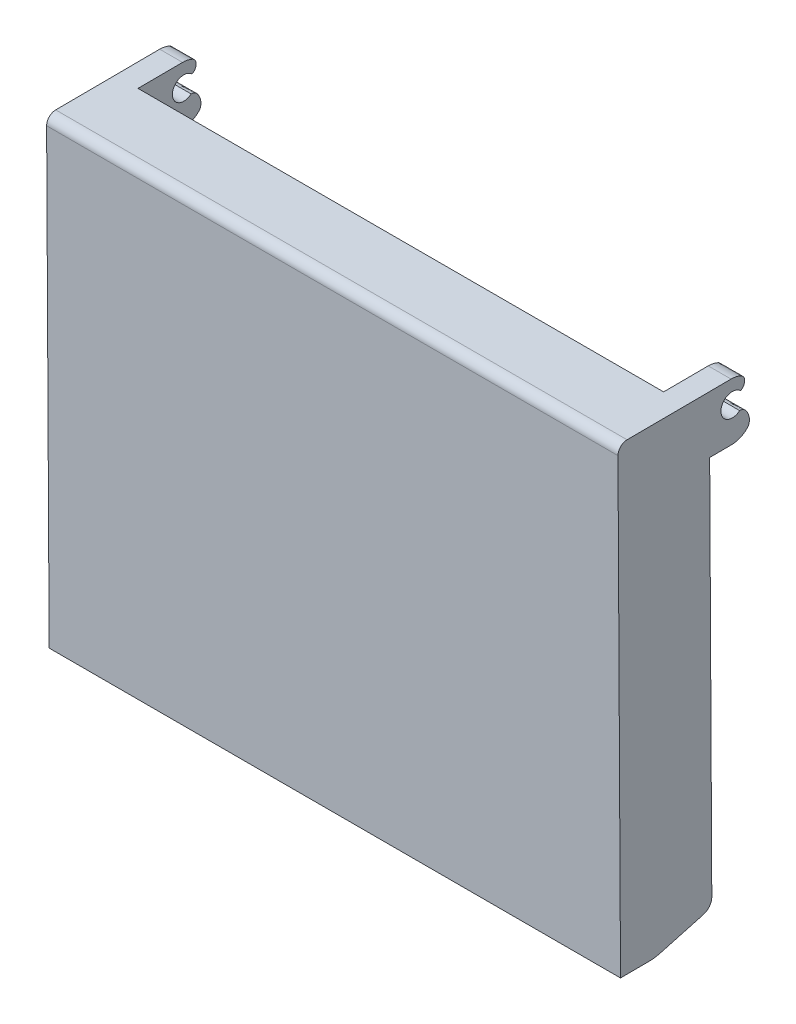
ISO-10303-21;
HEADER;
FILE_DESCRIPTION(('STEP AP214'),'2;1');
FILE_NAME('part.step','',(''),(''),'','','');
FILE_SCHEMA(('AUTOMOTIVE_DESIGN { 1 0 10303 214 1 1 1 1 }'));
ENDSEC;
DATA;
#1=APPLICATION_CONTEXT('core data for automotive mechanical design processes');
#2=APPLICATION_PROTOCOL_DEFINITION('international standard','automotive_design',2000,#1);
#3=PRODUCT_CONTEXT('',#1,'mechanical');
#4=PRODUCT('Part','Part','',(#3));
#5=PRODUCT_RELATED_PRODUCT_CATEGORY('part','',(#4));
#6=PRODUCT_DEFINITION_FORMATION('','',#4);
#7=PRODUCT_DEFINITION_CONTEXT('part definition',#1,'design');
#8=PRODUCT_DEFINITION('design','',#6,#7);
#9=PRODUCT_DEFINITION_SHAPE('','',#8);
#10=(LENGTH_UNIT() NAMED_UNIT(*) SI_UNIT(.MILLI.,.METRE.));
#11=(NAMED_UNIT(*) PLANE_ANGLE_UNIT() SI_UNIT($,.RADIAN.));
#12=(NAMED_UNIT(*) SI_UNIT($,.STERADIAN.) SOLID_ANGLE_UNIT());
#13=UNCERTAINTY_MEASURE_WITH_UNIT(LENGTH_MEASURE(1.E-05),#10,'distance_accuracy_value','');
#14=(GEOMETRIC_REPRESENTATION_CONTEXT(3) GLOBAL_UNCERTAINTY_ASSIGNED_CONTEXT((#13)) GLOBAL_UNIT_ASSIGNED_CONTEXT((#10,
#11,#12)) REPRESENTATION_CONTEXT('',''));
#15=CARTESIAN_POINT('',(0.,0.,0.));
#16=DIRECTION('',(0.,0.,1.));
#17=DIRECTION('',(1.,0.,0.));
#18=AXIS2_PLACEMENT_3D('',#15,#16,#17);
#19=CARTESIAN_POINT('',(-50.,35.629270835779,3.85844932793107));
#20=DIRECTION('',(0.,-0.999984213828862,-0.00561890497102754));
#21=DIRECTION('',(0.,0.00561890497102754,-0.999984213828862));
#22=AXIS2_PLACEMENT_3D('',#19,#20,#21);
#23=PLANE('',#22);
#24=DIRECTION('',(1.,0.,0.));
#25=VECTOR('',#24,1.);
#26=CARTESIAN_POINT('',(-50.,35.6180330258369,5.85841775558879));
#27=LINE('',#26,#25);
#28=CARTESIAN_POINT('',(-50.,35.6180330258369,5.85841775558879));
#29=VERTEX_POINT('',#28);
#30=CARTESIAN_POINT('',(-48.,35.6180330258369,5.85841775558879));
#31=VERTEX_POINT('',#30);
#32=EDGE_CURVE('E316',#29,#31,#27,.T.);
#33=ORIENTED_EDGE('',*,*,#32,.T.);
#34=DIRECTION('',(0.,-0.00561890497102722,0.999984213828862));
#35=VECTOR('',#34,1.);
#36=CARTESIAN_POINT('',(-48.,35.6273261920369,4.2045333158659));
#37=LINE('',#36,#35);
#38=CARTESIAN_POINT('',(-48.,35.6073571063884,7.75838776188092));
#39=VERTEX_POINT('',#38);
#40=EDGE_CURVE('E325',#31,#39,#37,.T.);
#41=ORIENTED_EDGE('',*,*,#40,.T.);
#42=DIRECTION('',(1.,0.,0.));
#43=VECTOR('',#42,1.);
#44=CARTESIAN_POINT('',(-50.,35.6073571063919,7.75838776188094));
#45=LINE('',#44,#43);
#46=CARTESIAN_POINT('',(-50.,35.6073571063919,7.75838776188094));
#47=VERTEX_POINT('',#46);
#48=EDGE_CURVE('E523',#47,#39,#45,.T.);
#49=ORIENTED_EDGE('',*,*,#48,.F.);
#50=DIRECTION('',(0.,0.00561890497102754,-0.999984213828862));
#51=VECTOR('',#50,1.);
#52=CARTESIAN_POINT('',(-50.,35.629270835779,3.85844932793107));
#53=LINE('',#52,#51);
#54=EDGE_CURVE('E211',#47,#29,#53,.T.);
#55=ORIENTED_EDGE('',*,*,#54,.T.);
#56=EDGE_LOOP('',(#33,#41,#49,#55));
#57=FACE_BOUND('',#56,.T.);
#58=ADVANCED_FACE('F41',(#57),#23,.T.);
#59=DIRECTION('',(0.,0.00561890497102324,-0.999984213828862));
#60=VECTOR('',#59,1.);
#61=CARTESIAN_POINT('',(-48.,35.5764531290514,13.2583009379101));
#62=LINE('',#61,#60);
#63=CARTESIAN_POINT('',(-48.,35.5764531290514,13.2583009379101));
#64=VERTEX_POINT('',#63);
#65=CARTESIAN_POINT('',(-48.,35.5961192964466,9.75835618950915));
#66=VERTEX_POINT('',#65);
#67=EDGE_CURVE('E445',#64,#66,#62,.T.);
#68=ORIENTED_EDGE('',*,*,#67,.T.);
#69=DIRECTION('',(1.,0.,0.));
#70=VECTOR('',#69,1.);
#71=CARTESIAN_POINT('',(-48.,35.5961192964466,9.75835618950915));
#72=LINE('',#71,#70);
#73=CARTESIAN_POINT('',(-2.,35.5961192964466,9.75835618950915));
#74=VERTEX_POINT('',#73);
#75=EDGE_CURVE('E427',#66,#74,#72,.T.);
#76=ORIENTED_EDGE('',*,*,#75,.T.);
#77=DIRECTION('',(0.,-0.00561890497102324,0.999984213828862));
#78=VECTOR('',#77,1.);
#79=CARTESIAN_POINT('',(-2.,35.5764531290514,13.2583009379101));
#80=LINE('',#79,#78);
#81=CARTESIAN_POINT('',(-2.,35.5764531290514,13.2583009379101));
#82=VERTEX_POINT('',#81);
#83=EDGE_CURVE('E437',#74,#82,#80,.T.);
#84=ORIENTED_EDGE('',*,*,#83,.T.);
#85=DIRECTION('',(-1.,0.,0.));
#86=VECTOR('',#85,1.);
#87=CARTESIAN_POINT('',(-48.,35.5764531290514,13.2583009379101));
#88=LINE('',#87,#86);
#89=EDGE_CURVE('E449',#82,#64,#88,.T.);
#90=ORIENTED_EDGE('',*,*,#89,.T.);
#91=EDGE_LOOP('',(#68,#76,#84,#90));
#92=FACE_BOUND('',#91,.T.);
#93=ADVANCED_FACE('F293',(#92),#23,.T.);
#94=CARTESIAN_POINT('',(-50.,40.5668220597414,14.9863686262867));
#95=DIRECTION('',(0.,0.99998421382886,0.00561890497132756));
#96=DIRECTION('',(0.,-0.00561890497132756,0.99998421382886));
#97=AXIS2_PLACEMENT_3D('',#94,#95,#96);
#98=PLANE('',#97);
#99=DIRECTION('',(-1.,0.,0.));
#100=VECTOR('',#99,1.);
#101=CARTESIAN_POINT('',(0.,40.5960403655924,9.7864507143643));
#102=LINE('',#101,#100);
#103=CARTESIAN_POINT('',(-2.,40.5960403655924,9.7864507143643));
#104=VERTEX_POINT('',#103);
#105=CARTESIAN_POINT('',(-48.,40.5960403655924,9.7864507143643));
#106=VERTEX_POINT('',#105);
#107=EDGE_CURVE('E433',#104,#106,#102,.T.);
#108=ORIENTED_EDGE('',*,*,#107,.T.);
#109=DIRECTION('',(0.,0.00561890497132756,-0.99998421382886));
#110=VECTOR('',#109,1.);
#111=CARTESIAN_POINT('',(-48.,40.6272472611844,4.23262784072103));
#112=LINE('',#111,#110);
#113=CARTESIAN_POINT('',(-48.,40.6179540949805,5.88651228044453));
#114=VERTEX_POINT('',#113);
#115=EDGE_CURVE('E200',#106,#114,#112,.T.);
#116=ORIENTED_EDGE('',*,*,#115,.T.);
#117=DIRECTION('',(1.,0.,0.));
#118=VECTOR('',#117,1.);
#119=CARTESIAN_POINT('',(-50.,40.6179540949805,5.88651228044453));
#120=LINE('',#119,#118);
#121=CARTESIAN_POINT('',(-50.,40.6179540949805,5.88651228044453));
#122=VERTEX_POINT('',#121);
#123=EDGE_CURVE('E189',#114,#122,#120,.F.);
#124=ORIENTED_EDGE('',*,*,#123,.T.);
#125=DIRECTION('',(0.,-0.00561890497132756,0.99998421382886));
#126=VECTOR('',#125,1.);
#127=CARTESIAN_POINT('',(-50.,40.5668220597414,14.9863686262867));
#128=LINE('',#127,#126);
#129=CARTESIAN_POINT('',(-50.,40.5668220597414,14.9863686262867));
#130=VERTEX_POINT('',#129);
#131=EDGE_CURVE('E191',#122,#130,#128,.T.);
#132=ORIENTED_EDGE('',*,*,#131,.T.);
#133=DIRECTION('',(1.,0.,0.));
#134=VECTOR('',#133,1.);
#135=CARTESIAN_POINT('',(-50.,40.5668220597414,14.9863686262867));
#136=LINE('',#135,#134);
#137=CARTESIAN_POINT('',(0.,40.5668220597414,14.9863686262867));
#138=VERTEX_POINT('',#137);
#139=EDGE_CURVE('E359',#130,#138,#136,.T.);
#140=ORIENTED_EDGE('',*,*,#139,.T.);
#141=DIRECTION('',(0.,-0.00561890497132756,0.99998421382886));
#142=VECTOR('',#141,1.);
#143=CARTESIAN_POINT('',(0.,40.5668220597414,14.9863686262867));
#144=LINE('',#143,#142);
#145=CARTESIAN_POINT('',(0.,40.6179540949805,5.88651228044453));
#146=VERTEX_POINT('',#145);
#147=EDGE_CURVE('E353',#146,#138,#144,.T.);
#148=ORIENTED_EDGE('',*,*,#147,.F.);
#149=CARTESIAN_POINT('',(-2.,40.6179540949805,5.88651228044453));
#150=VERTEX_POINT('',#149);
#151=EDGE_CURVE('E203',#146,#150,#120,.F.);
#152=ORIENTED_EDGE('',*,*,#151,.T.);
#153=DIRECTION('',(0.,-0.00561890497132756,0.99998421382886));
#154=VECTOR('',#153,1.);
#155=CARTESIAN_POINT('',(-2.,40.6272472611844,4.23262784072103));
#156=LINE('',#155,#154);
#157=EDGE_CURVE('E647',#150,#104,#156,.T.);
#158=ORIENTED_EDGE('',*,*,#157,.T.);
#159=EDGE_LOOP('',(#108,#116,#124,#132,#140,#148,#152,#158));
#160=FACE_BOUND('',#159,.T.);
#161=ADVANCED_FACE('F193',(#160),#98,.T.);
#162=CARTESIAN_POINT('',(-50.,37.6180014534946,5.86965556553085));
#163=DIRECTION('',(1.,0.,0.));
#164=DIRECTION('',(0.,0.,-1.));
#165=AXIS2_PLACEMENT_3D('',#162,#163,#164);
#166=CYLINDRICAL_SURFACE('',#165,2.);
#167=DIRECTION('',(1.,0.,0.));
#168=VECTOR('',#167,1.);
#169=CARTESIAN_POINT('',(-54.5855952912798,36.2117565477546,4.44751799655936));
#170=LINE('',#169,#168);
#171=CARTESIAN_POINT('',(-50.,36.2117565477546,4.44751799655936));
#172=VERTEX_POINT('',#171);
#173=CARTESIAN_POINT('',(-48.,36.2117565477546,4.44751799655936));
#174=VERTEX_POINT('',#173);
#175=EDGE_CURVE('E86',#172,#174,#170,.T.);
#176=ORIENTED_EDGE('',*,*,#175,.T.);
#177=CARTESIAN_POINT('',(-48.,37.6180014534946,5.86965556553085));
#178=DIRECTION('',(-1.,0.,0.));
#179=DIRECTION('',(0.,0.,1.));
#180=AXIS2_PLACEMENT_3D('',#177,#178,#179);
#181=CIRCLE('',#180,2.);
#182=EDGE_CURVE('E582',#174,#31,#181,.T.);
#183=ORIENTED_EDGE('',*,*,#182,.T.);
#184=ORIENTED_EDGE('',*,*,#32,.F.);
#185=CARTESIAN_POINT('',(-50.,37.6180014534946,5.86965556553085));
#186=DIRECTION('',(1.,0.,0.));
#187=DIRECTION('',(0.,0.,-1.));
#188=AXIS2_PLACEMENT_3D('',#185,#186,#187);
#189=CIRCLE('',#188,2.);
#190=EDGE_CURVE('E331',#172,#29,#189,.F.);
#191=ORIENTED_EDGE('',*,*,#190,.F.);
#192=EDGE_LOOP('',(#176,#183,#184,#191));
#193=FACE_BOUND('',#192,.T.);
#194=ADVANCED_FACE('F287',(#193),#166,.T.);
#195=CARTESIAN_POINT('',(-2.,35.6180330258369,5.85841775558879));
#196=VERTEX_POINT('',#195);
#197=CARTESIAN_POINT('',(0.,35.6180330258369,5.85841775558879));
#198=VERTEX_POINT('',#197);
#199=EDGE_CURVE('E328',#196,#198,#27,.T.);
#200=ORIENTED_EDGE('',*,*,#199,.F.);
#201=CARTESIAN_POINT('',(-2.,37.6180014534946,5.86965556553085));
#202=DIRECTION('',(1.,0.,0.));
#203=DIRECTION('',(0.,0.,-1.));
#204=AXIS2_PLACEMENT_3D('',#201,#202,#203);
#205=CIRCLE('',#204,2.);
#206=CARTESIAN_POINT('',(-2.,36.2117565477546,4.44751799655936));
#207=VERTEX_POINT('',#206);
#208=EDGE_CURVE('E572',#196,#207,#205,.T.);
#209=ORIENTED_EDGE('',*,*,#208,.T.);
#210=CARTESIAN_POINT('',(0.,36.2117565477546,4.44751799655936));
#211=VERTEX_POINT('',#210);
#212=EDGE_CURVE('E581',#207,#211,#170,.T.);
#213=ORIENTED_EDGE('',*,*,#212,.T.);
#214=CARTESIAN_POINT('',(0.,37.6180014534946,5.86965556553085));
#215=DIRECTION('',(1.,0.,0.));
#216=DIRECTION('',(0.,0.,-1.));
#217=AXIS2_PLACEMENT_3D('',#214,#215,#216);
#218=CIRCLE('',#217,2.);
#219=EDGE_CURVE('E326',#198,#211,#218,.T.);
#220=ORIENTED_EDGE('',*,*,#219,.F.);
#221=EDGE_LOOP('',(#200,#209,#213,#220));
#222=FACE_BOUND('',#221,.T.);
#223=ADVANCED_FACE('F305',(#222),#166,.T.);
#224=CARTESIAN_POINT('',(-52.8284271247462,38.6185475578199,5.77527604911899));
#225=DIRECTION('',(1.,0.,0.));
#226=DIRECTION('',(0.,0.,-1.));
#227=AXIS2_PLACEMENT_3D('',#224,#225,#226);
#228=CYLINDRICAL_SURFACE('',#227,1.);
#229=DIRECTION('',(1.,0.,0.));
#230=VECTOR('',#229,1.);
#231=CARTESIAN_POINT('',(-25.,39.3659393935742,5.11089254251468));
#232=LINE('',#231,#230);
#233=CARTESIAN_POINT('',(-50.,39.3659393935874,5.11089254252955));
#234=VERTEX_POINT('',#233);
#235=CARTESIAN_POINT('',(-48.,39.3659393935742,5.11089254251468));
#236=VERTEX_POINT('',#235);
#237=EDGE_CURVE('E605',#234,#236,#232,.T.);
#238=ORIENTED_EDGE('',*,*,#237,.T.);
#239=CARTESIAN_POINT('',(-48.,38.6185475578199,5.77527604911899));
#240=DIRECTION('',(-1.,0.,0.));
#241=DIRECTION('',(0.,0.,1.));
#242=AXIS2_PLACEMENT_3D('',#239,#240,#241);
#243=CIRCLE('',#242,1.);
#244=CARTESIAN_POINT('',(-48.,37.8515960543217,5.13357098346829));
#245=VERTEX_POINT('',#244);
#246=EDGE_CURVE('E552',#245,#236,#243,.T.);
#247=ORIENTED_EDGE('',*,*,#246,.F.);
#248=DIRECTION('',(1.,0.,0.));
#249=VECTOR('',#248,1.);
#250=CARTESIAN_POINT('',(-25.,37.8515960543217,5.13357098346829));
#251=LINE('',#250,#249);
#252=CARTESIAN_POINT('',(-50.,37.8515960543219,5.13357098346802));
#253=VERTEX_POINT('',#252);
#254=EDGE_CURVE('E51',#245,#253,#251,.F.);
#255=ORIENTED_EDGE('',*,*,#254,.T.);
#256=CARTESIAN_POINT('',(-50.,38.6185475578199,5.77527604911899));
#257=DIRECTION('',(1.,0.,0.));
#258=DIRECTION('',(0.,0.,-1.));
#259=AXIS2_PLACEMENT_3D('',#256,#257,#258);
#260=CIRCLE('',#259,1.);
#261=EDGE_CURVE('E76',#253,#234,#260,.F.);
#262=ORIENTED_EDGE('',*,*,#261,.T.);
#263=EDGE_LOOP('',(#238,#247,#255,#262));
#264=FACE_BOUND('',#263,.T.);
#265=ADVANCED_FACE('F243',(#264),#228,.F.);
#266=CARTESIAN_POINT('',(-50.,38.6179856673228,5.87527447050187));
#267=DIRECTION('',(1.,0.,0.));
#268=DIRECTION('',(0.,0.,-1.));
#269=AXIS2_PLACEMENT_3D('',#266,#267,#268);
#270=CYLINDRICAL_SURFACE('',#269,2.);
#271=ORIENTED_EDGE('',*,*,#123,.F.);
#272=CARTESIAN_POINT('',(-48.,38.6179856673228,5.87527447050187));
#273=DIRECTION('',(-1.,0.,0.));
#274=DIRECTION('',(0.,0.,1.));
#275=AXIS2_PLACEMENT_3D('',#272,#273,#274);
#276=CIRCLE('',#275,2.);
#277=CARTESIAN_POINT('',(-48.,40.421981196519,5.01179306905756));
#278=VERTEX_POINT('',#277);
#279=EDGE_CURVE('E554',#114,#278,#276,.T.);
#280=ORIENTED_EDGE('',*,*,#279,.T.);
#281=DIRECTION('',(1.,0.,0.));
#282=VECTOR('',#281,1.);
#283=CARTESIAN_POINT('',(-54.5855952912798,40.421981196519,5.01179306905756));
#284=LINE('',#283,#282);
#285=CARTESIAN_POINT('',(-50.,40.421981196519,5.01179306905756));
#286=VERTEX_POINT('',#285);
#287=EDGE_CURVE('E220',#286,#278,#284,.T.);
#288=ORIENTED_EDGE('',*,*,#287,.F.);
#289=CARTESIAN_POINT('',(-50.,38.6179856673228,5.87527447050187));
#290=DIRECTION('',(1.,0.,0.));
#291=DIRECTION('',(0.,0.,-1.));
#292=AXIS2_PLACEMENT_3D('',#289,#290,#291);
#293=CIRCLE('',#292,2.);
#294=EDGE_CURVE('E209',#122,#286,#293,.F.);
#295=ORIENTED_EDGE('',*,*,#294,.F.);
#296=EDGE_LOOP('',(#271,#280,#288,#295));
#297=FACE_BOUND('',#296,.T.);
#298=ADVANCED_FACE('F43',(#297),#270,.T.);
#299=CARTESIAN_POINT('',(-2.,40.421981196519,5.01179306905756));
#300=VERTEX_POINT('',#299);
#301=CARTESIAN_POINT('',(0.,40.421981196519,5.01179306905756));
#302=VERTEX_POINT('',#301);
#303=EDGE_CURVE('E369',#300,#302,#284,.T.);
#304=ORIENTED_EDGE('',*,*,#303,.F.);
#305=CARTESIAN_POINT('',(-2.,38.6179856673228,5.87527447050187));
#306=DIRECTION('',(1.,0.,0.));
#307=DIRECTION('',(0.,0.,-1.));
#308=AXIS2_PLACEMENT_3D('',#305,#306,#307);
#309=CIRCLE('',#308,2.);
#310=EDGE_CURVE('E368',#300,#150,#309,.T.);
#311=ORIENTED_EDGE('',*,*,#310,.T.);
#312=ORIENTED_EDGE('',*,*,#151,.F.);
#313=CARTESIAN_POINT('',(0.,38.6179856673228,5.87527447050187));
#314=DIRECTION('',(1.,0.,0.));
#315=DIRECTION('',(0.,0.,-1.));
#316=AXIS2_PLACEMENT_3D('',#313,#314,#315);
#317=CIRCLE('',#316,2.);
#318=EDGE_CURVE('E205',#302,#146,#317,.T.);
#319=ORIENTED_EDGE('',*,*,#318,.F.);
#320=EDGE_LOOP('',(#304,#311,#312,#319));
#321=FACE_BOUND('',#320,.T.);
#322=ADVANCED_FACE('F366',(#321),#270,.T.);
#323=CARTESIAN_POINT('',(-54.5855952912798,40.421981196519,5.01179306905756));
#324=CARTESIAN_POINT('',(-54.5855952912798,40.2676940085454,4.6942452529616));
#325=CARTESIAN_POINT('',(-54.5855952912798,39.7711007176045,4.58747860629509));
#326=CARTESIAN_POINT('',(-54.5855952912798,39.3484402788669,4.95426922400517));
#327=CARTESIAN_POINT('',(-54.5855952912798,39.3212925364311,5.08101016856365));
#328=CARTESIAN_POINT('',(-54.5855952912798,39.4827014458556,5.272048408987));
#329=B_SPLINE_CURVE_WITH_KNOTS('',3,(#323,#324,#325,#326,#327,#328),.UNSPECIFIED.,.F.,.F.,(4,1,
1,4),(0.,0.655528334715118,0.86913506720803,1.),.UNSPECIFIED.);
#330=DIRECTION('',(1.,0.,0.));
#331=VECTOR('',#330,1.);
#332=SURFACE_OF_LINEAR_EXTRUSION('',#329,#331);
#333=CARTESIAN_POINT('',(-48.,40.421981196519,5.01179306905756));
#334=CARTESIAN_POINT('',(-48.,40.2676940085454,4.6942452529616));
#335=CARTESIAN_POINT('',(-48.,39.7711007176045,4.58747860629509));
#336=CARTESIAN_POINT('',(-48.,39.3484402788669,4.95426922400517));
#337=CARTESIAN_POINT('',(-48.,39.3212925364311,5.08101016856365));
#338=CARTESIAN_POINT('',(-48.,39.4827014458556,5.272048408987));
#339=B_SPLINE_CURVE_WITH_KNOTS('',3,(#333,#334,#335,#336,#337,#338),.UNSPECIFIED.,.F.,.F.,(4,1,
1,4),(0.,0.655528334715118,0.86913506720803,1.),.UNSPECIFIED.);
#340=EDGE_CURVE('E635',#236,#278,#339,.F.);
#341=ORIENTED_EDGE('',*,*,#340,.F.);
#342=ORIENTED_EDGE('',*,*,#237,.F.);
#343=CARTESIAN_POINT('',(-50.,40.421981196519,5.01179306905756));
#344=CARTESIAN_POINT('',(-50.,40.2676940085454,4.6942452529616));
#345=CARTESIAN_POINT('',(-50.,39.7711007176045,4.58747860629509));
#346=CARTESIAN_POINT('',(-50.,39.3484402788669,4.95426922400517));
#347=CARTESIAN_POINT('',(-50.,39.3212925364311,5.08101016856365));
#348=CARTESIAN_POINT('',(-50.,39.4827014458556,5.272048408987));
#349=B_SPLINE_CURVE_WITH_KNOTS('',3,(#343,#344,#345,#346,#347,#348),.UNSPECIFIED.,.F.,.F.,(4,1,
1,4),(0.,0.655528334715118,0.86913506720803,1.),.UNSPECIFIED.);
#350=EDGE_CURVE('E390',#234,#286,#349,.F.);
#351=ORIENTED_EDGE('',*,*,#350,.T.);
#352=ORIENTED_EDGE('',*,*,#287,.T.);
#353=EDGE_LOOP('',(#341,#342,#351,#352));
#354=FACE_BOUND('',#353,.T.);
#355=ADVANCED_FACE('F407',(#354),#332,.F.);
#356=CARTESIAN_POINT('',(-2.,40.421981196519,5.01179306905756));
#357=CARTESIAN_POINT('',(-2.,40.2676940085454,4.6942452529616));
#358=CARTESIAN_POINT('',(-2.,39.7711007176045,4.58747860629509));
#359=CARTESIAN_POINT('',(-2.,39.3484402788669,4.95426922400517));
#360=CARTESIAN_POINT('',(-2.,39.3212925364311,5.08101016856365));
#361=CARTESIAN_POINT('',(-2.,39.4827014458556,5.272048408987));
#362=B_SPLINE_CURVE_WITH_KNOTS('',3,(#356,#357,#358,#359,#360,#361),.UNSPECIFIED.,.F.,.F.,(4,1,
1,4),(0.,0.655528334715118,0.86913506720803,1.),.UNSPECIFIED.);
#363=CARTESIAN_POINT('',(-2.,39.3659393935742,5.11089254251468));
#364=VERTEX_POINT('',#363);
#365=EDGE_CURVE('E374',#300,#364,#362,.T.);
#366=ORIENTED_EDGE('',*,*,#365,.F.);
#367=ORIENTED_EDGE('',*,*,#303,.T.);
#368=CARTESIAN_POINT('',(0.,40.421981196519,5.01179306905756));
#369=CARTESIAN_POINT('',(0.,40.2676940085454,4.6942452529616));
#370=CARTESIAN_POINT('',(0.,39.7711007176045,4.58747860629509));
#371=CARTESIAN_POINT('',(0.,39.3484402788669,4.95426922400517));
#372=CARTESIAN_POINT('',(0.,39.3212925364311,5.08101016856365));
#373=CARTESIAN_POINT('',(0.,39.4827014458556,5.272048408987));
#374=B_SPLINE_CURVE_WITH_KNOTS('',3,(#368,#369,#370,#371,#372,#373),.UNSPECIFIED.,.F.,.F.,(4,1,
1,4),(0.,0.655528334715118,0.86913506720803,1.),.UNSPECIFIED.);
#375=CARTESIAN_POINT('',(0.,39.3657639968427,5.11055934466205));
#376=VERTEX_POINT('',#375);
#377=EDGE_CURVE('E354',#302,#376,#374,.T.);
#378=ORIENTED_EDGE('',*,*,#377,.T.);
#379=EDGE_CURVE('E44',#364,#376,#232,.T.);
#380=ORIENTED_EDGE('',*,*,#379,.F.);
#381=EDGE_LOOP('',(#366,#367,#378,#380));
#382=FACE_BOUND('',#381,.T.);
#383=ADVANCED_FACE('F415',(#382),#332,.F.);
#384=CARTESIAN_POINT('',(-54.5855952912798,37.6449704911308,5.54691735053936));
#385=CARTESIAN_POINT('',(-54.5855952912798,38.4278575110948,4.70785367610959));
#386=CARTESIAN_POINT('',(-54.5855952912798,36.7952649262127,3.93280205212484));
#387=CARTESIAN_POINT('',(-54.5855952912798,36.2117565477546,4.44751799655936));
#388=B_SPLINE_CURVE_WITH_KNOTS('',3,(#384,#385,#386,#387),.UNSPECIFIED.,.F.,.F.,(4,4),(0.,1.),.UNSPECIFIED.);
#389=DIRECTION('',(1.,0.,0.));
#390=VECTOR('',#389,1.);
#391=SURFACE_OF_LINEAR_EXTRUSION('',#388,#390);
#392=ORIENTED_EDGE('',*,*,#254,.F.);
#393=CARTESIAN_POINT('',(-48.,37.6449704911308,5.54691735053936));
#394=CARTESIAN_POINT('',(-48.,38.4278575110948,4.70785367610959));
#395=CARTESIAN_POINT('',(-48.,36.7952649262127,3.93280205212484));
#396=CARTESIAN_POINT('',(-48.,36.2117565477546,4.44751799655936));
#397=B_SPLINE_CURVE_WITH_KNOTS('',3,(#393,#394,#395,#396),.UNSPECIFIED.,.F.,.F.,(4,4),(0.,1.),.UNSPECIFIED.);
#398=EDGE_CURVE('E633',#174,#245,#397,.F.);
#399=ORIENTED_EDGE('',*,*,#398,.F.);
#400=ORIENTED_EDGE('',*,*,#175,.F.);
#401=CARTESIAN_POINT('',(-50.,37.6449704911308,5.54691735053936));
#402=CARTESIAN_POINT('',(-50.,38.4278575110948,4.70785367610959));
#403=CARTESIAN_POINT('',(-50.,36.7952649262127,3.93280205212484));
#404=CARTESIAN_POINT('',(-50.,36.2117565477546,4.44751799655936));
#405=B_SPLINE_CURVE_WITH_KNOTS('',3,(#401,#402,#403,#404),.UNSPECIFIED.,.F.,.F.,(4,4),(0.,1.),.UNSPECIFIED.);
#406=EDGE_CURVE('E381',#172,#253,#405,.F.);
#407=ORIENTED_EDGE('',*,*,#406,.T.);
#408=EDGE_LOOP('',(#392,#399,#400,#407));
#409=FACE_BOUND('',#408,.T.);
#410=ADVANCED_FACE('F257',(#409),#391,.F.);
#411=CARTESIAN_POINT('',(-50.,2.20933829801592,8.57074029188366));
#412=DIRECTION('',(1.,0.,0.));
#413=DIRECTION('',(0.,0.,-1.));
#414=AXIS2_PLACEMENT_3D('',#411,#412,#413);
#415=PLANE('',#414);
#416=ORIENTED_EDGE('',*,*,#406,.F.);
#417=ORIENTED_EDGE('',*,*,#190,.T.);
#418=ORIENTED_EDGE('',*,*,#54,.F.);
#419=DIRECTION('',(0.,0.999984213828857,0.0056189049718733));
#420=VECTOR('',#419,1.);
#421=CARTESIAN_POINT('',(-50.,35.6073571063919,7.75838776188094));
#422=LINE('',#421,#420);
#423=CARTESIAN_POINT('',(-50.,2.21495720298779,7.57075607805505));
#424=VERTEX_POINT('',#423);
#425=EDGE_CURVE('E472',#424,#47,#422,.T.);
#426=ORIENTED_EDGE('',*,*,#425,.F.);
#427=CARTESIAN_POINT('',(-50.,2.20933829801592,8.57074029188366));
#428=DIRECTION('',(1.,0.,0.));
#429=DIRECTION('',(0.,0.,-1.));
#430=AXIS2_PLACEMENT_3D('',#427,#428,#429);
#431=CIRCLE('',#430,0.999999999999753);
#432=CARTESIAN_POINT('',(-50.,1.24488199961676,8.30649788711545));
#433=VERTEX_POINT('',#432);
#434=EDGE_CURVE('E473',#433,#424,#431,.T.);
#435=ORIENTED_EDGE('',*,*,#434,.F.);
#436=DIRECTION('',(0.,0.264242404768274,-0.964456298399404));
#437=VECTOR('',#436,1.);
#438=CARTESIAN_POINT('',(-50.,1.24488199961676,8.30649788711545));
#439=LINE('',#438,#437);
#440=CARTESIAN_POINT('',(-50.,0.218975680834482,12.0509453825316));
#441=VERTEX_POINT('',#440);
#442=EDGE_CURVE('E490',#441,#433,#439,.T.);
#443=ORIENTED_EDGE('',*,*,#442,.F.);
#444=CARTESIAN_POINT('',(-50.,4.07680087442819,13.1079150016036));
#445=DIRECTION('',(1.,0.,0.));
#446=DIRECTION('',(0.,0.,-1.));
#447=AXIS2_PLACEMENT_3D('',#444,#445,#446);
#448=CIRCLE('',#447,3.99999999999595);
#449=CARTESIAN_POINT('',(-50.,0.0768640191168013,13.0854393817184));
#450=VERTEX_POINT('',#449);
#451=EDGE_CURVE('E488',#450,#441,#448,.T.);
#452=ORIENTED_EDGE('',*,*,#451,.F.);
#453=DIRECTION('',(0.,0.00561890497132623,-0.99998421382886));
#454=VECTOR('',#453,1.);
#455=CARTESIAN_POINT('',(-50.,0.0768640191168013,13.0854393817184));
#456=LINE('',#455,#454);
#457=CARTESIAN_POINT('',(-50.,0.0629662756955474,15.5587903460109));
#458=VERTEX_POINT('',#457);
#459=EDGE_CURVE('E481',#458,#450,#456,.T.);
#460=ORIENTED_EDGE('',*,*,#459,.F.);
#461=DIRECTION('',(0.,-0.99998421382886,-0.005618904971319));
#462=VECTOR('',#461,1.);
#463=CARTESIAN_POINT('',(-50.,0.0629662756955474,15.5587903460109));
#464=LINE('',#463,#462);
#465=CARTESIAN_POINT('',(-50.,39.7623395647018,15.7818608733723));
#466=VERTEX_POINT('',#465);
#467=EDGE_CURVE('E478',#466,#458,#464,.T.);
#468=ORIENTED_EDGE('',*,*,#467,.F.);
#469=CARTESIAN_POINT('',(-50.,39.7668346886788,14.9818735023096));
#470=DIRECTION('',(1.,0.,0.));
#471=DIRECTION('',(0.,0.,-1.));
#472=AXIS2_PLACEMENT_3D('',#469,#470,#471);
#473=CIRCLE('',#472,0.79999999999954);
#474=EDGE_CURVE('E215',#130,#466,#473,.T.);
#475=ORIENTED_EDGE('',*,*,#474,.F.);
#476=ORIENTED_EDGE('',*,*,#131,.F.);
#477=ORIENTED_EDGE('',*,*,#294,.T.);
#478=ORIENTED_EDGE('',*,*,#350,.F.);
#479=ORIENTED_EDGE('',*,*,#261,.F.);
#480=EDGE_LOOP('',(#416,#417,#418,#426,#435,#443,#452,#460,#468,#475,#476,#477,#478,#479));
#481=FACE_BOUND('',#480,.T.);
#482=ADVANCED_FACE('F210',(#481),#415,.F.);
#483=CARTESIAN_POINT('',(-50.,35.6073571063919,7.75838776188094));
#484=DIRECTION('',(0.,0.0056189049718733,-0.999984213828857));
#485=DIRECTION('',(0.,0.999984213828857,0.0056189049718733));
#486=AXIS2_PLACEMENT_3D('',#483,#484,#485);
#487=PLANE('',#486);
#488=ORIENTED_EDGE('',*,*,#48,.T.);
#489=DIRECTION('',(0.,-0.999984213828862,-0.00561890497102324));
#490=VECTOR('',#489,1.);
#491=CARTESIAN_POINT('',(-48.,35.607357106392,7.75838776186303));
#492=LINE('',#491,#490);
#493=CARTESIAN_POINT('',(-48.,2.21495720298688,7.57075607806552));
#494=VERTEX_POINT('',#493);
#495=EDGE_CURVE('E448',#39,#494,#492,.T.);
#496=ORIENTED_EDGE('',*,*,#495,.T.);
#497=DIRECTION('',(1.,0.,0.));
#498=VECTOR('',#497,1.);
#499=CARTESIAN_POINT('',(-50.,2.21495720298779,7.57075607805505));
#500=LINE('',#499,#498);
#501=EDGE_CURVE('E340',#424,#494,#500,.T.);
#502=ORIENTED_EDGE('',*,*,#501,.F.);
#503=ORIENTED_EDGE('',*,*,#425,.T.);
#504=EDGE_LOOP('',(#488,#496,#502,#503));
#505=FACE_BOUND('',#504,.T.);
#506=ADVANCED_FACE('F256',(#505),#487,.T.);
#507=CARTESIAN_POINT('',(-50.,2.20933829801592,8.57074029188366));
#508=DIRECTION('',(1.,0.,0.));
#509=DIRECTION('',(0.,0.,-1.));
#510=AXIS2_PLACEMENT_3D('',#507,#508,#509);
#511=CYLINDRICAL_SURFACE('',#510,0.999999999999753);
#512=CARTESIAN_POINT('',(-48.,2.20933829801592,8.57074029188366));
#513=DIRECTION('',(-1.,0.,0.));
#514=DIRECTION('',(0.,0.,1.));
#515=AXIS2_PLACEMENT_3D('',#512,#513,#514);
#516=CIRCLE('',#515,0.999999999999753);
#517=CARTESIAN_POINT('',(-48.,1.24488199961676,8.30649788711545));
#518=VERTEX_POINT('',#517);
#519=EDGE_CURVE('E466',#518,#494,#516,.F.);
#520=ORIENTED_EDGE('',*,*,#519,.F.);
#521=DIRECTION('',(1.,0.,0.));
#522=VECTOR('',#521,1.);
#523=CARTESIAN_POINT('',(-50.,1.24488199961676,8.30649788711545));
#524=LINE('',#523,#522);
#525=EDGE_CURVE('E332',#433,#518,#524,.T.);
#526=ORIENTED_EDGE('',*,*,#525,.F.);
#527=ORIENTED_EDGE('',*,*,#434,.T.);
#528=ORIENTED_EDGE('',*,*,#501,.T.);
#529=EDGE_LOOP('',(#520,#526,#527,#528));
#530=FACE_BOUND('',#529,.T.);
#531=ADVANCED_FACE('F297',(#530),#511,.T.);
#532=CARTESIAN_POINT('',(-50.,1.24488199961676,8.30649788711545));
#533=DIRECTION('',(0.,-0.964456298399403,-0.264242404768274));
#534=DIRECTION('',(0.,0.264242404768274,-0.964456298399404));
#535=AXIS2_PLACEMENT_3D('',#532,#533,#534);
#536=PLANE('',#535);
#537=DIRECTION('',(0.,0.264242404768274,-0.964456298399404));
#538=VECTOR('',#537,1.);
#539=CARTESIAN_POINT('',(-48.,1.24488199961676,8.30649788711545));
#540=LINE('',#539,#538);
#541=CARTESIAN_POINT('',(-48.,0.218975680834482,12.0509453825316));
#542=VERTEX_POINT('',#541);
#543=EDGE_CURVE('E467',#542,#518,#540,.T.);
#544=ORIENTED_EDGE('',*,*,#543,.F.);
#545=DIRECTION('',(1.,0.,0.));
#546=VECTOR('',#545,1.);
#547=CARTESIAN_POINT('',(-50.,0.218975680834482,12.0509453825316));
#548=LINE('',#547,#546);
#549=EDGE_CURVE('E513',#441,#542,#548,.T.);
#550=ORIENTED_EDGE('',*,*,#549,.F.);
#551=ORIENTED_EDGE('',*,*,#442,.T.);
#552=ORIENTED_EDGE('',*,*,#525,.T.);
#553=EDGE_LOOP('',(#544,#550,#551,#552));
#554=FACE_BOUND('',#553,.T.);
#555=ADVANCED_FACE('F272',(#554),#536,.T.);
#556=CARTESIAN_POINT('',(-2.,2.20933829801592,8.57074029188366));
#557=DIRECTION('',(1.,0.,0.));
#558=DIRECTION('',(0.,0.,-1.));
#559=AXIS2_PLACEMENT_3D('',#556,#557,#558);
#560=CIRCLE('',#559,0.999999999999753);
#561=CARTESIAN_POINT('',(-2.,2.21495720298688,7.57075607806552));
#562=VERTEX_POINT('',#561);
#563=CARTESIAN_POINT('',(-2.,1.24488199961676,8.30649788711545));
#564=VERTEX_POINT('',#563);
#565=EDGE_CURVE('E464',#562,#564,#560,.F.);
#566=ORIENTED_EDGE('',*,*,#565,.F.);
#567=CARTESIAN_POINT('',(0.,2.21495720298779,7.57075607805505));
#568=VERTEX_POINT('',#567);
#569=EDGE_CURVE('E495',#562,#568,#500,.T.);
#570=ORIENTED_EDGE('',*,*,#569,.T.);
#571=CARTESIAN_POINT('',(0.,2.20933829801592,8.57074029188366));
#572=DIRECTION('',(1.,0.,0.));
#573=DIRECTION('',(0.,0.,-1.));
#574=AXIS2_PLACEMENT_3D('',#571,#572,#573);
#575=CIRCLE('',#574,0.999999999999753);
#576=CARTESIAN_POINT('',(0.,1.24488199961676,8.30649788711545));
#577=VERTEX_POINT('',#576);
#578=EDGE_CURVE('E468',#577,#568,#575,.T.);
#579=ORIENTED_EDGE('',*,*,#578,.F.);
#580=EDGE_CURVE('E511',#564,#577,#524,.T.);
#581=ORIENTED_EDGE('',*,*,#580,.F.);
#582=EDGE_LOOP('',(#566,#570,#579,#581));
#583=FACE_BOUND('',#582,.T.);
#584=ADVANCED_FACE('F269',(#583),#511,.T.);
#585=DIRECTION('',(0.,-0.264242404768274,0.964456298399404));
#586=VECTOR('',#585,1.);
#587=CARTESIAN_POINT('',(-2.,1.24488199961676,8.30649788711545));
#588=LINE('',#587,#586);
#589=CARTESIAN_POINT('',(-2.,0.218975680834482,12.0509453825316));
#590=VERTEX_POINT('',#589);
#591=EDGE_CURVE('E460',#564,#590,#588,.T.);
#592=ORIENTED_EDGE('',*,*,#591,.F.);
#593=ORIENTED_EDGE('',*,*,#580,.T.);
#594=DIRECTION('',(0.,0.264242404768274,-0.964456298399404));
#595=VECTOR('',#594,1.);
#596=CARTESIAN_POINT('',(0.,1.24488199961676,8.30649788711545));
#597=LINE('',#596,#595);
#598=CARTESIAN_POINT('',(0.,0.218975680834482,12.0509453825316));
#599=VERTEX_POINT('',#598);
#600=EDGE_CURVE('E474',#599,#577,#597,.T.);
#601=ORIENTED_EDGE('',*,*,#600,.F.);
#602=EDGE_CURVE('E516',#590,#599,#548,.T.);
#603=ORIENTED_EDGE('',*,*,#602,.F.);
#604=EDGE_LOOP('',(#592,#593,#601,#603));
#605=FACE_BOUND('',#604,.T.);
#606=ADVANCED_FACE('F263',(#605),#536,.T.);
#607=CARTESIAN_POINT('',(-50.,4.07680087442819,13.1079150016036));
#608=DIRECTION('',(1.,0.,0.));
#609=DIRECTION('',(0.,0.,-1.));
#610=AXIS2_PLACEMENT_3D('',#607,#608,#609);
#611=CYLINDRICAL_SURFACE('',#610,3.99999999999595);
#612=CARTESIAN_POINT('',(-48.,4.07680087442819,13.1079150016036));
#613=DIRECTION('',(-1.,0.,0.));
#614=DIRECTION('',(0.,0.,1.));
#615=AXIS2_PLACEMENT_3D('',#612,#613,#614);
#616=CIRCLE('',#615,3.99999999999595);
#617=CARTESIAN_POINT('',(-48.,0.0771020491541971,13.0588303087817));
#618=VERTEX_POINT('',#617);
#619=EDGE_CURVE('E344',#618,#542,#616,.F.);
#620=ORIENTED_EDGE('',*,*,#619,.F.);
#621=DIRECTION('',(1.,0.,0.));
#622=VECTOR('',#621,1.);
#623=CARTESIAN_POINT('',(-50.,0.0771020491541971,13.0588303087817));
#624=LINE('',#623,#622);
#625=CARTESIAN_POINT('',(-2.,0.0771020491541971,13.0588303087817));
#626=VERTEX_POINT('',#625);
#627=EDGE_CURVE('E341',#626,#618,#624,.F.);
#628=ORIENTED_EDGE('',*,*,#627,.F.);
#629=CARTESIAN_POINT('',(-2.,4.07680087442819,13.1079150016036));
#630=DIRECTION('',(1.,0.,0.));
#631=DIRECTION('',(0.,0.,-1.));
#632=AXIS2_PLACEMENT_3D('',#629,#630,#631);
#633=CIRCLE('',#632,3.99999999999595);
#634=EDGE_CURVE('E343',#590,#626,#633,.F.);
#635=ORIENTED_EDGE('',*,*,#634,.F.);
#636=ORIENTED_EDGE('',*,*,#602,.T.);
#637=CARTESIAN_POINT('',(0.,4.07680087442819,13.1079150016036));
#638=DIRECTION('',(1.,0.,0.));
#639=DIRECTION('',(0.,0.,-1.));
#640=AXIS2_PLACEMENT_3D('',#637,#638,#639);
#641=CIRCLE('',#640,3.99999999999595);
#642=CARTESIAN_POINT('',(0.,0.0768640191168013,13.0854393817184));
#643=VERTEX_POINT('',#642);
#644=EDGE_CURVE('E510',#643,#599,#641,.T.);
#645=ORIENTED_EDGE('',*,*,#644,.F.);
#646=DIRECTION('',(1.,0.,0.));
#647=VECTOR('',#646,1.);
#648=CARTESIAN_POINT('',(-50.,0.0768640191168013,13.0854393817184));
#649=LINE('',#648,#647);
#650=EDGE_CURVE('E517',#450,#643,#649,.T.);
#651=ORIENTED_EDGE('',*,*,#650,.F.);
#652=ORIENTED_EDGE('',*,*,#451,.T.);
#653=ORIENTED_EDGE('',*,*,#549,.T.);
#654=EDGE_LOOP('',(#620,#628,#635,#636,#645,#651,#652,#653));
#655=FACE_BOUND('',#654,.T.);
#656=ADVANCED_FACE('F266',(#655),#611,.T.);
#657=CARTESIAN_POINT('',(-50.,0.0768640191168013,13.0854393817184));
#658=DIRECTION('',(0.,-0.99998421382886,-0.00561890497132622));
#659=DIRECTION('',(0.,0.00561890497132622,-0.99998421382886));
#660=AXIS2_PLACEMENT_3D('',#657,#658,#659);
#661=PLANE('',#660);
#662=DIRECTION('',(0.,0.00561890497132623,-0.99998421382886));
#663=VECTOR('',#662,1.);
#664=CARTESIAN_POINT('',(0.,0.0768640191168013,13.0854393817184));
#665=LINE('',#664,#663);
#666=CARTESIAN_POINT('',(0.,0.0629662756955474,15.5587903460109));
#667=VERTEX_POINT('',#666);
#668=EDGE_CURVE('E502',#667,#643,#665,.T.);
#669=ORIENTED_EDGE('',*,*,#668,.F.);
#670=DIRECTION('',(1.,0.,0.));
#671=VECTOR('',#670,1.);
#672=CARTESIAN_POINT('',(-50.,0.0629662756955474,15.5587903460109));
#673=LINE('',#672,#671);
#674=EDGE_CURVE('E522',#458,#667,#673,.T.);
#675=ORIENTED_EDGE('',*,*,#674,.F.);
#676=ORIENTED_EDGE('',*,*,#459,.T.);
#677=ORIENTED_EDGE('',*,*,#650,.T.);
#678=EDGE_LOOP('',(#669,#675,#676,#677));
#679=FACE_BOUND('',#678,.T.);
#680=ADVANCED_FACE('F274',(#679),#661,.T.);
#681=CARTESIAN_POINT('',(-50.,0.0629662756955474,15.5587903460109));
#682=DIRECTION('',(0.,-0.005618904971319,0.99998421382886));
#683=DIRECTION('',(0.,-0.99998421382886,-0.005618904971319));
#684=AXIS2_PLACEMENT_3D('',#681,#682,#683);
#685=PLANE('',#684);
#686=DIRECTION('',(0.,-0.99998421382886,-0.005618904971319));
#687=VECTOR('',#686,1.);
#688=CARTESIAN_POINT('',(0.,0.0629662756955474,15.5587903460109));
#689=LINE('',#688,#687);
#690=CARTESIAN_POINT('',(0.,39.7623395647018,15.7818608733723));
#691=VERTEX_POINT('',#690);
#692=EDGE_CURVE('E501',#691,#667,#689,.T.);
#693=ORIENTED_EDGE('',*,*,#692,.F.);
#694=DIRECTION('',(1.,0.,0.));
#695=VECTOR('',#694,1.);
#696=CARTESIAN_POINT('',(-50.,39.7623395647018,15.7818608733723));
#697=LINE('',#696,#695);
#698=EDGE_CURVE('E524',#466,#691,#697,.T.);
#699=ORIENTED_EDGE('',*,*,#698,.F.);
#700=ORIENTED_EDGE('',*,*,#467,.T.);
#701=ORIENTED_EDGE('',*,*,#674,.T.);
#702=EDGE_LOOP('',(#693,#699,#700,#701));
#703=FACE_BOUND('',#702,.T.);
#704=ADVANCED_FACE('F276',(#703),#685,.T.);
#705=CARTESIAN_POINT('',(-50.,39.7668346886788,14.9818735023096));
#706=DIRECTION('',(1.,0.,0.));
#707=DIRECTION('',(0.,0.,-1.));
#708=AXIS2_PLACEMENT_3D('',#705,#706,#707);
#709=CYLINDRICAL_SURFACE('',#708,0.79999999999954);
#710=CARTESIAN_POINT('',(0.,39.7668346886788,14.9818735023096));
#711=DIRECTION('',(1.,0.,0.));
#712=DIRECTION('',(0.,0.,-1.));
#713=AXIS2_PLACEMENT_3D('',#710,#711,#712);
#714=CIRCLE('',#713,0.79999999999954);
#715=EDGE_CURVE('E365',#138,#691,#714,.T.);
#716=ORIENTED_EDGE('',*,*,#715,.F.);
#717=ORIENTED_EDGE('',*,*,#139,.F.);
#718=ORIENTED_EDGE('',*,*,#474,.T.);
#719=ORIENTED_EDGE('',*,*,#698,.T.);
#720=EDGE_LOOP('',(#716,#717,#718,#719));
#721=FACE_BOUND('',#720,.T.);
#722=ADVANCED_FACE('F285',(#721),#709,.T.);
#723=DIRECTION('',(0.,-0.00561890497102722,0.999984213828862));
#724=VECTOR('',#723,1.);
#725=CARTESIAN_POINT('',(-2.,35.6273261920369,4.2045333158659));
#726=LINE('',#725,#724);
#727=CARTESIAN_POINT('',(-2.,35.6073571063884,7.75838776188092));
#728=VERTEX_POINT('',#727);
#729=EDGE_CURVE('E559',#196,#728,#726,.T.);
#730=ORIENTED_EDGE('',*,*,#729,.F.);
#731=ORIENTED_EDGE('',*,*,#199,.T.);
#732=DIRECTION('',(0.,0.00561890497102754,-0.999984213828862));
#733=VECTOR('',#732,1.);
#734=CARTESIAN_POINT('',(0.,35.629270835779,3.85844932793107));
#735=LINE('',#734,#733);
#736=CARTESIAN_POINT('',(0.,35.6073571063919,7.75838776188094));
#737=VERTEX_POINT('',#736);
#738=EDGE_CURVE('E361',#737,#198,#735,.T.);
#739=ORIENTED_EDGE('',*,*,#738,.F.);
#740=EDGE_CURVE('E530',#728,#737,#45,.T.);
#741=ORIENTED_EDGE('',*,*,#740,.F.);
#742=EDGE_LOOP('',(#730,#731,#739,#741));
#743=FACE_BOUND('',#742,.T.);
#744=ADVANCED_FACE('F288',(#743),#23,.T.);
#745=DIRECTION('',(0.,-0.999984213828862,-0.00561890497102324));
#746=VECTOR('',#745,1.);
#747=CARTESIAN_POINT('',(-2.,35.607357106392,7.75838776186303));
#748=LINE('',#747,#746);
#749=EDGE_CURVE('E456',#728,#562,#748,.T.);
#750=ORIENTED_EDGE('',*,*,#749,.F.);
#751=ORIENTED_EDGE('',*,*,#740,.T.);
#752=DIRECTION('',(0.,0.999984213828857,0.0056189049718733));
#753=VECTOR('',#752,1.);
#754=CARTESIAN_POINT('',(0.,35.6073571063919,7.75838776188094));
#755=LINE('',#754,#753);
#756=EDGE_CURVE('E492',#568,#737,#755,.T.);
#757=ORIENTED_EDGE('',*,*,#756,.F.);
#758=ORIENTED_EDGE('',*,*,#569,.F.);
#759=EDGE_LOOP('',(#750,#751,#757,#758));
#760=FACE_BOUND('',#759,.T.);
#761=ADVANCED_FACE('F264',(#760),#487,.T.);
#762=CARTESIAN_POINT('',(0.,2.20933829801592,8.57074029188366));
#763=DIRECTION('',(1.,0.,0.));
#764=DIRECTION('',(0.,0.,-1.));
#765=AXIS2_PLACEMENT_3D('',#762,#763,#764);
#766=PLANE('',#765);
#767=CARTESIAN_POINT('',(0.,37.6449704911308,5.54691735053936));
#768=CARTESIAN_POINT('',(0.,38.4278575110948,4.70785367610959));
#769=CARTESIAN_POINT('',(0.,36.7952649262127,3.93280205212484));
#770=CARTESIAN_POINT('',(0.,36.2117565477546,4.44751799655936));
#771=B_SPLINE_CURVE_WITH_KNOTS('',3,(#767,#768,#769,#770),.UNSPECIFIED.,.F.,.F.,(4,4),(0.,1.),.UNSPECIFIED.);
#772=CARTESIAN_POINT('',(0.,37.8516335434188,5.13312707653075));
#773=VERTEX_POINT('',#772);
#774=EDGE_CURVE('E372',#773,#211,#771,.T.);
#775=ORIENTED_EDGE('',*,*,#774,.F.);
#776=CARTESIAN_POINT('',(0.,38.6185475578199,5.77527604911899));
#777=DIRECTION('',(1.,0.,0.));
#778=DIRECTION('',(0.,0.74714911710383,-0.664656450213919));
#779=AXIS2_PLACEMENT_3D('',#776,#777,#778);
#780=CIRCLE('',#779,0.999999999999999);
#781=EDGE_CURVE('E601',#376,#773,#780,.T.);
#782=ORIENTED_EDGE('',*,*,#781,.F.);
#783=ORIENTED_EDGE('',*,*,#377,.F.);
#784=ORIENTED_EDGE('',*,*,#318,.T.);
#785=ORIENTED_EDGE('',*,*,#147,.T.);
#786=ORIENTED_EDGE('',*,*,#715,.T.);
#787=ORIENTED_EDGE('',*,*,#692,.T.);
#788=ORIENTED_EDGE('',*,*,#668,.T.);
#789=ORIENTED_EDGE('',*,*,#644,.T.);
#790=ORIENTED_EDGE('',*,*,#600,.T.);
#791=ORIENTED_EDGE('',*,*,#578,.T.);
#792=ORIENTED_EDGE('',*,*,#756,.T.);
#793=ORIENTED_EDGE('',*,*,#738,.T.);
#794=ORIENTED_EDGE('',*,*,#219,.T.);
#795=EDGE_LOOP('',(#775,#782,#783,#784,#785,#786,#787,#788,#789,#790,#791,#792,#793,#794));
#796=FACE_BOUND('',#795,.T.);
#797=ADVANCED_FACE('F253',(#796),#766,.T.);
#798=CARTESIAN_POINT('',(-48.,35.5764531290514,13.2583009379101));
#799=DIRECTION('',(-1.,0.,0.));
#800=DIRECTION('',(0.,0.,1.));
#801=AXIS2_PLACEMENT_3D('',#798,#799,#800);
#802=PLANE('',#801);
#803=ORIENTED_EDGE('',*,*,#519,.T.);
#804=ORIENTED_EDGE('',*,*,#495,.F.);
#805=ORIENTED_EDGE('',*,*,#40,.F.);
#806=ORIENTED_EDGE('',*,*,#182,.F.);
#807=ORIENTED_EDGE('',*,*,#398,.T.);
#808=ORIENTED_EDGE('',*,*,#246,.T.);
#809=ORIENTED_EDGE('',*,*,#340,.T.);
#810=ORIENTED_EDGE('',*,*,#279,.F.);
#811=ORIENTED_EDGE('',*,*,#115,.F.);
#812=DIRECTION('',(0.,-0.999984213828862,-0.00561890497102726));
#813=VECTOR('',#812,1.);
#814=CARTESIAN_POINT('',(-48.,40.6819815588305,9.78693361738539));
#815=LINE('',#814,#813);
#816=EDGE_CURVE('E442',#106,#66,#815,.T.);
#817=ORIENTED_EDGE('',*,*,#816,.T.);
#818=ORIENTED_EDGE('',*,*,#67,.F.);
#819=DIRECTION('',(0.,-0.999984213828862,-0.00561890497102324));
#820=VECTOR('',#819,1.);
#821=CARTESIAN_POINT('',(-48.,35.5764531290514,13.2583009379101));
#822=LINE('',#821,#820);
#823=EDGE_CURVE('E452',#64,#618,#822,.T.);
#824=ORIENTED_EDGE('',*,*,#823,.T.);
#825=ORIENTED_EDGE('',*,*,#619,.T.);
#826=ORIENTED_EDGE('',*,*,#543,.T.);
#827=EDGE_LOOP('',(#803,#804,#805,#806,#807,#808,#809,#810,#811,#817,#818,#824,#825,#826));
#828=FACE_BOUND('',#827,.T.);
#829=ADVANCED_FACE('F248',(#828),#802,.F.);
#830=CARTESIAN_POINT('',(-48.,35.5764531290514,13.2583009379101));
#831=DIRECTION('',(0.,-0.00561890497102324,0.999984213828862));
#832=DIRECTION('',(0.,-0.999984213828862,-0.00561890497102324));
#833=AXIS2_PLACEMENT_3D('',#830,#831,#832);
#834=PLANE('',#833);
#835=ORIENTED_EDGE('',*,*,#627,.T.);
#836=ORIENTED_EDGE('',*,*,#823,.F.);
#837=ORIENTED_EDGE('',*,*,#89,.F.);
#838=DIRECTION('',(0.,-0.999984213828862,-0.00561890497102324));
#839=VECTOR('',#838,1.);
#840=CARTESIAN_POINT('',(-2.,35.5764531290514,13.2583009379101));
#841=LINE('',#840,#839);
#842=EDGE_CURVE('E447',#82,#626,#841,.T.);
#843=ORIENTED_EDGE('',*,*,#842,.T.);
#844=EDGE_LOOP('',(#835,#836,#837,#843));
#845=FACE_BOUND('',#844,.T.);
#846=ADVANCED_FACE('F246',(#845),#834,.F.);
#847=CARTESIAN_POINT('',(-2.,35.5764531290514,13.2583009379101));
#848=DIRECTION('',(1.,0.,0.));
#849=DIRECTION('',(0.,0.,-1.));
#850=AXIS2_PLACEMENT_3D('',#847,#848,#849);
#851=PLANE('',#850);
#852=ORIENTED_EDGE('',*,*,#565,.T.);
#853=ORIENTED_EDGE('',*,*,#591,.T.);
#854=ORIENTED_EDGE('',*,*,#634,.T.);
#855=ORIENTED_EDGE('',*,*,#842,.F.);
#856=ORIENTED_EDGE('',*,*,#83,.F.);
#857=DIRECTION('',(0.,0.999984213828862,0.00561890497102726));
#858=VECTOR('',#857,1.);
#859=CARTESIAN_POINT('',(-2.,40.6819815588305,9.78693361738539));
#860=LINE('',#859,#858);
#861=EDGE_CURVE('E428',#74,#104,#860,.T.);
#862=ORIENTED_EDGE('',*,*,#861,.T.);
#863=ORIENTED_EDGE('',*,*,#157,.F.);
#864=ORIENTED_EDGE('',*,*,#310,.F.);
#865=ORIENTED_EDGE('',*,*,#365,.T.);
#866=CARTESIAN_POINT('',(-2.,38.6185475578199,5.77527604911899));
#867=DIRECTION('',(1.,0.,0.));
#868=DIRECTION('',(0.,0.,-1.));
#869=AXIS2_PLACEMENT_3D('',#866,#867,#868);
#870=CIRCLE('',#869,1.);
#871=CARTESIAN_POINT('',(-2.,37.8515960543217,5.13357098346829));
#872=VERTEX_POINT('',#871);
#873=EDGE_CURVE('E56',#364,#872,#870,.T.);
#874=ORIENTED_EDGE('',*,*,#873,.T.);
#875=CARTESIAN_POINT('',(-2.,37.6449704911308,5.54691735053936));
#876=CARTESIAN_POINT('',(-2.,38.4278575110948,4.70785367610959));
#877=CARTESIAN_POINT('',(-2.,36.7952649262127,3.93280205212484));
#878=CARTESIAN_POINT('',(-2.,36.2117565477546,4.44751799655936));
#879=B_SPLINE_CURVE_WITH_KNOTS('',3,(#875,#876,#877,#878),.UNSPECIFIED.,.F.,.F.,(4,4),(0.,1.),.UNSPECIFIED.);
#880=EDGE_CURVE('E562',#872,#207,#879,.T.);
#881=ORIENTED_EDGE('',*,*,#880,.T.);
#882=ORIENTED_EDGE('',*,*,#208,.F.);
#883=ORIENTED_EDGE('',*,*,#729,.T.);
#884=ORIENTED_EDGE('',*,*,#749,.T.);
#885=EDGE_LOOP('',(#852,#853,#854,#855,#856,#862,#863,#864,#865,#874,#881,#882,#883,#884));
#886=FACE_BOUND('',#885,.T.);
#887=ADVANCED_FACE('F241',(#886),#851,.F.);
#888=EDGE_CURVE('E11',#773,#872,#251,.F.);
#889=ORIENTED_EDGE('',*,*,#888,.T.);
#890=ORIENTED_EDGE('',*,*,#873,.F.);
#891=ORIENTED_EDGE('',*,*,#379,.T.);
#892=ORIENTED_EDGE('',*,*,#781,.T.);
#893=EDGE_LOOP('',(#889,#890,#891,#892));
#894=FACE_BOUND('',#893,.T.);
#895=ADVANCED_FACE('F229',(#894),#228,.F.);
#896=ORIENTED_EDGE('',*,*,#212,.F.);
#897=ORIENTED_EDGE('',*,*,#880,.F.);
#898=ORIENTED_EDGE('',*,*,#888,.F.);
#899=ORIENTED_EDGE('',*,*,#774,.T.);
#900=EDGE_LOOP('',(#896,#897,#898,#899));
#901=FACE_BOUND('',#900,.T.);
#902=ADVANCED_FACE('F239',(#901),#391,.F.);
#903=CARTESIAN_POINT('',(0.,-0.053706566534899,9.55804004352643));
#904=DIRECTION('',(0.,-0.00561890497102726,0.999984213828862));
#905=DIRECTION('',(0.,-0.999984213828862,-0.00561890497102726));
#906=AXIS2_PLACEMENT_3D('',#903,#904,#905);
#907=PLANE('',#906);
#908=ORIENTED_EDGE('',*,*,#861,.F.);
#909=ORIENTED_EDGE('',*,*,#75,.F.);
#910=ORIENTED_EDGE('',*,*,#816,.F.);
#911=ORIENTED_EDGE('',*,*,#107,.F.);
#912=EDGE_LOOP('',(#908,#909,#910,#911));
#913=FACE_BOUND('',#912,.T.);
#914=ADVANCED_FACE('F411',(#913),#907,.F.);
#915=CLOSED_SHELL('',(#58,#93,#161,#194,#223,#265,#298,#322,#355,#383,#410,#482,#506,#531,#555,
#584,#606,#656,#680,#704,#722,#744,#761,#797,#829,#846,#887,#895,#902,#914));
#916=MANIFOLD_SOLID_BREP('B2',#915);
#917=ADVANCED_BREP_SHAPE_REPRESENTATION('',(#18,#916),#14);
#918=SHAPE_DEFINITION_REPRESENTATION(#9,#917);
ENDSEC;
END-ISO-10303-21;
